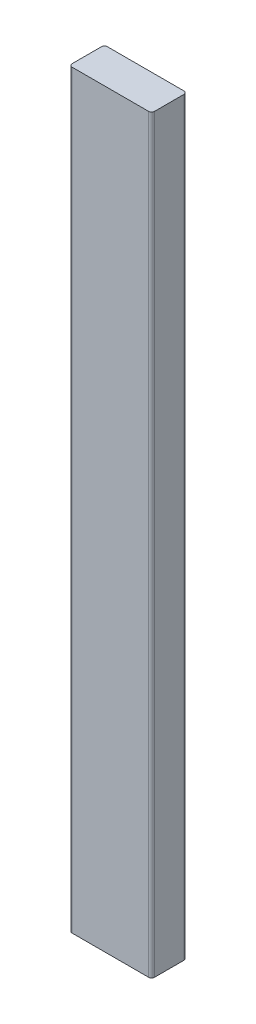
ISO-10303-21;
HEADER;
FILE_DESCRIPTION(('STEP AP214'),'2;1');
FILE_NAME('part.step','',(''),(''),'','','');
FILE_SCHEMA(('AUTOMOTIVE_DESIGN { 1 0 10303 214 1 1 1 1 }'));
ENDSEC;
DATA;
#1=APPLICATION_CONTEXT('core data for automotive mechanical design processes');
#2=APPLICATION_PROTOCOL_DEFINITION('international standard','automotive_design',2000,#1);
#3=PRODUCT_CONTEXT('',#1,'mechanical');
#4=PRODUCT('Part','Part','',(#3));
#5=PRODUCT_RELATED_PRODUCT_CATEGORY('part','',(#4));
#6=PRODUCT_DEFINITION_FORMATION('','',#4);
#7=PRODUCT_DEFINITION_CONTEXT('part definition',#1,'design');
#8=PRODUCT_DEFINITION('design','',#6,#7);
#9=PRODUCT_DEFINITION_SHAPE('','',#8);
#10=(LENGTH_UNIT() NAMED_UNIT(*) SI_UNIT(.MILLI.,.METRE.));
#11=(NAMED_UNIT(*) PLANE_ANGLE_UNIT() SI_UNIT($,.RADIAN.));
#12=(NAMED_UNIT(*) SI_UNIT($,.STERADIAN.) SOLID_ANGLE_UNIT());
#13=UNCERTAINTY_MEASURE_WITH_UNIT(LENGTH_MEASURE(1.E-05),#10,'distance_accuracy_value','');
#14=(GEOMETRIC_REPRESENTATION_CONTEXT(3) GLOBAL_UNCERTAINTY_ASSIGNED_CONTEXT((#13)) GLOBAL_UNIT_ASSIGNED_CONTEXT((#10,
#11,#12)) REPRESENTATION_CONTEXT('',''));
#15=CARTESIAN_POINT('',(0.,0.,0.));
#16=DIRECTION('',(0.,0.,1.));
#17=DIRECTION('',(1.,0.,0.));
#18=AXIS2_PLACEMENT_3D('',#15,#16,#17);
#19=CARTESIAN_POINT('',(-44.4500000000001,808.0375,-19.0499999999989));
#20=DIRECTION('',(1.,0.,0.));
#21=DIRECTION('',(0.,0.,-1.));
#22=AXIS2_PLACEMENT_3D('',#19,#20,#21);
#23=PLANE('',#22);
#24=DIRECTION('',(0.,0.,1.));
#25=VECTOR('',#24,1.);
#26=CARTESIAN_POINT('',(-44.4500000000001,808.0375,-19.0499999999989));
#27=LINE('',#26,#25);
#28=CARTESIAN_POINT('',(-44.4500000000001,808.0375,-15.874999999999));
#29=VERTEX_POINT('',#28);
#30=CARTESIAN_POINT('',(-44.45,808.0375,15.875000000001));
#31=VERTEX_POINT('',#30);
#32=EDGE_CURVE('E118',#29,#31,#27,.T.);
#33=ORIENTED_EDGE('',*,*,#32,.F.);
#34=DIRECTION('',(0.,-1.,0.));
#35=VECTOR('',#34,1.);
#36=CARTESIAN_POINT('',(-44.4500000000001,808.0375,-15.874999999999));
#37=LINE('',#36,#35);
#38=CARTESIAN_POINT('',(-44.4500000000001,0.,-15.8750000000001));
#39=VERTEX_POINT('',#38);
#40=EDGE_CURVE('E103',#29,#39,#37,.T.);
#41=ORIENTED_EDGE('',*,*,#40,.T.);
#42=DIRECTION('',(0.,0.,1.));
#43=VECTOR('',#42,1.);
#44=CARTESIAN_POINT('',(-44.4500000000001,0.,-19.05));
#45=LINE('',#44,#43);
#46=CARTESIAN_POINT('',(-44.45,0.,15.8750000000001));
#47=VERTEX_POINT('',#46);
#48=EDGE_CURVE('E115',#39,#47,#45,.T.);
#49=ORIENTED_EDGE('',*,*,#48,.T.);
#50=DIRECTION('',(0.,-1.,0.));
#51=VECTOR('',#50,1.);
#52=CARTESIAN_POINT('',(-44.45,808.0375,15.875000000001));
#53=LINE('',#52,#51);
#54=EDGE_CURVE('E120',#47,#31,#53,.F.);
#55=ORIENTED_EDGE('',*,*,#54,.T.);
#56=EDGE_LOOP('',(#33,#41,#49,#55));
#57=FACE_BOUND('',#56,.T.);
#58=ADVANCED_FACE('F34',(#57),#23,.F.);
#59=CARTESIAN_POINT('',(44.4499999999997,808.0375,19.0500000000011));
#60=DIRECTION('',(0.,0.,-1.));
#61=DIRECTION('',(-1.,0.,0.));
#62=AXIS2_PLACEMENT_3D('',#59,#60,#61);
#63=PLANE('',#62);
#64=DIRECTION('',(1.,0.,0.));
#65=VECTOR('',#64,1.);
#66=CARTESIAN_POINT('',(44.4499999999997,808.0375,19.0500000000011));
#67=LINE('',#66,#65);
#68=CARTESIAN_POINT('',(-41.275,808.0375,19.0500000000011));
#69=VERTEX_POINT('',#68);
#70=CARTESIAN_POINT('',(41.2749999999997,808.0375,19.0500000000011));
#71=VERTEX_POINT('',#70);
#72=EDGE_CURVE('E169',#69,#71,#67,.T.);
#73=ORIENTED_EDGE('',*,*,#72,.F.);
#74=DIRECTION('',(0.,-1.,0.));
#75=VECTOR('',#74,1.);
#76=CARTESIAN_POINT('',(-41.275,808.0375,19.0500000000011));
#77=LINE('',#76,#75);
#78=CARTESIAN_POINT('',(-41.275,0.,19.05));
#79=VERTEX_POINT('',#78);
#80=EDGE_CURVE('E153',#69,#79,#77,.T.);
#81=ORIENTED_EDGE('',*,*,#80,.T.);
#82=DIRECTION('',(1.,0.,0.));
#83=VECTOR('',#82,1.);
#84=CARTESIAN_POINT('',(44.4499999999997,0.,19.05));
#85=LINE('',#84,#83);
#86=CARTESIAN_POINT('',(41.2749999999997,0.,19.05));
#87=VERTEX_POINT('',#86);
#88=EDGE_CURVE('E124',#79,#87,#85,.T.);
#89=ORIENTED_EDGE('',*,*,#88,.T.);
#90=DIRECTION('',(0.,-1.,0.));
#91=VECTOR('',#90,1.);
#92=CARTESIAN_POINT('',(41.2749999999997,808.0375,19.0500000000011));
#93=LINE('',#92,#91);
#94=EDGE_CURVE('E151',#87,#71,#93,.F.);
#95=ORIENTED_EDGE('',*,*,#94,.T.);
#96=EDGE_LOOP('',(#73,#81,#89,#95));
#97=FACE_BOUND('',#96,.T.);
#98=ADVANCED_FACE('F179',(#97),#63,.F.);
#99=CARTESIAN_POINT('',(44.4499999999997,808.0375,-19.0499999999989));
#100=DIRECTION('',(-1.,0.,0.));
#101=DIRECTION('',(0.,0.,1.));
#102=AXIS2_PLACEMENT_3D('',#99,#100,#101);
#103=PLANE('',#102);
#104=DIRECTION('',(0.,0.,-1.));
#105=VECTOR('',#104,1.);
#106=CARTESIAN_POINT('',(44.4499999999998,0.,-19.05));
#107=LINE('',#106,#105);
#108=CARTESIAN_POINT('',(44.4499999999997,0.,15.8750000000001));
#109=VERTEX_POINT('',#108);
#110=CARTESIAN_POINT('',(44.4499999999997,0.,-15.8750000000001));
#111=VERTEX_POINT('',#110);
#112=EDGE_CURVE('E127',#109,#111,#107,.T.);
#113=ORIENTED_EDGE('',*,*,#112,.T.);
#114=DIRECTION('',(0.,-1.,0.));
#115=VECTOR('',#114,1.);
#116=CARTESIAN_POINT('',(44.4499999999997,808.0375,-15.874999999999));
#117=LINE('',#116,#115);
#118=CARTESIAN_POINT('',(44.4499999999997,808.0375,-15.874999999999));
#119=VERTEX_POINT('',#118);
#120=EDGE_CURVE('E11',#111,#119,#117,.F.);
#121=ORIENTED_EDGE('',*,*,#120,.T.);
#122=DIRECTION('',(0.,0.,-1.));
#123=VECTOR('',#122,1.);
#124=CARTESIAN_POINT('',(44.4499999999997,808.0375,-19.0499999999989));
#125=LINE('',#124,#123);
#126=CARTESIAN_POINT('',(44.4499999999997,808.0375,15.875000000001));
#127=VERTEX_POINT('',#126);
#128=EDGE_CURVE('E159',#127,#119,#125,.T.);
#129=ORIENTED_EDGE('',*,*,#128,.F.);
#130=DIRECTION('',(0.,-1.,0.));
#131=VECTOR('',#130,1.);
#132=CARTESIAN_POINT('',(44.4499999999997,808.0375,15.875000000001));
#133=LINE('',#132,#131);
#134=EDGE_CURVE('E42',#127,#109,#133,.T.);
#135=ORIENTED_EDGE('',*,*,#134,.T.);
#136=EDGE_LOOP('',(#113,#121,#129,#135));
#137=FACE_BOUND('',#136,.T.);
#138=ADVANCED_FACE('F158',(#137),#103,.F.);
#139=CARTESIAN_POINT('',(44.4499999999997,808.0375,-19.0499999999989));
#140=DIRECTION('',(0.,0.,1.));
#141=DIRECTION('',(1.,0.,0.));
#142=AXIS2_PLACEMENT_3D('',#139,#140,#141);
#143=PLANE('',#142);
#144=DIRECTION('',(-1.,0.,0.));
#145=VECTOR('',#144,1.);
#146=CARTESIAN_POINT('',(44.4499999999998,0.,-19.05));
#147=LINE('',#146,#145);
#148=CARTESIAN_POINT('',(41.2749999999998,0.,-19.05));
#149=VERTEX_POINT('',#148);
#150=CARTESIAN_POINT('',(-41.2750000000001,0.,-19.05));
#151=VERTEX_POINT('',#150);
#152=EDGE_CURVE('E134',#149,#151,#147,.T.);
#153=ORIENTED_EDGE('',*,*,#152,.T.);
#154=DIRECTION('',(0.,-1.,0.));
#155=VECTOR('',#154,1.);
#156=CARTESIAN_POINT('',(-41.2750000000001,808.0375,-19.0499999999989));
#157=LINE('',#156,#155);
#158=CARTESIAN_POINT('',(-41.2750000000001,808.0375,-19.0499999999989));
#159=VERTEX_POINT('',#158);
#160=EDGE_CURVE('E104',#151,#159,#157,.F.);
#161=ORIENTED_EDGE('',*,*,#160,.T.);
#162=DIRECTION('',(-1.,0.,0.));
#163=VECTOR('',#162,1.);
#164=CARTESIAN_POINT('',(44.4499999999997,808.0375,-19.0499999999989));
#165=LINE('',#164,#163);
#166=CARTESIAN_POINT('',(41.2749999999997,808.0375,-19.0499999999989));
#167=VERTEX_POINT('',#166);
#168=EDGE_CURVE('E130',#167,#159,#165,.T.);
#169=ORIENTED_EDGE('',*,*,#168,.F.);
#170=DIRECTION('',(0.,-1.,0.));
#171=VECTOR('',#170,1.);
#172=CARTESIAN_POINT('',(41.2749999999997,808.0375,-19.0499999999989));
#173=LINE('',#172,#171);
#174=EDGE_CURVE('E109',#167,#149,#173,.T.);
#175=ORIENTED_EDGE('',*,*,#174,.T.);
#176=EDGE_LOOP('',(#153,#161,#169,#175));
#177=FACE_BOUND('',#176,.T.);
#178=ADVANCED_FACE('F167',(#177),#143,.F.);
#179=CARTESIAN_POINT('',(0.,808.0375,1.12410081243297E-12));
#180=DIRECTION('',(0.,-1.,0.));
#181=DIRECTION('',(0.,0.,-1.));
#182=AXIS2_PLACEMENT_3D('',#179,#180,#181);
#183=PLANE('',#182);
#184=ORIENTED_EDGE('',*,*,#168,.T.);
#185=CARTESIAN_POINT('',(-41.2750000000001,808.0375,-15.874999999999));
#186=DIRECTION('',(0.,-1.,0.));
#187=DIRECTION('',(0.,0.,-1.));
#188=AXIS2_PLACEMENT_3D('',#185,#186,#187);
#189=CIRCLE('',#188,3.175);
#190=EDGE_CURVE('E149',#159,#29,#189,.F.);
#191=ORIENTED_EDGE('',*,*,#190,.T.);
#192=ORIENTED_EDGE('',*,*,#32,.T.);
#193=CARTESIAN_POINT('',(-41.275,808.0375,15.875000000001));
#194=DIRECTION('',(0.,-1.,0.));
#195=DIRECTION('',(0.,0.,-1.));
#196=AXIS2_PLACEMENT_3D('',#193,#194,#195);
#197=CIRCLE('',#196,3.175);
#198=EDGE_CURVE('E147',#31,#69,#197,.F.);
#199=ORIENTED_EDGE('',*,*,#198,.T.);
#200=ORIENTED_EDGE('',*,*,#72,.T.);
#201=CARTESIAN_POINT('',(41.2749999999997,808.0375,15.875000000001));
#202=DIRECTION('',(0.,-1.,0.));
#203=DIRECTION('',(0.,0.,-1.));
#204=AXIS2_PLACEMENT_3D('',#201,#202,#203);
#205=CIRCLE('',#204,3.175);
#206=EDGE_CURVE('E54',#71,#127,#205,.F.);
#207=ORIENTED_EDGE('',*,*,#206,.T.);
#208=ORIENTED_EDGE('',*,*,#128,.T.);
#209=CARTESIAN_POINT('',(41.2749999999997,808.0375,-15.874999999999));
#210=DIRECTION('',(0.,-1.,0.));
#211=DIRECTION('',(0.,0.,-1.));
#212=AXIS2_PLACEMENT_3D('',#209,#210,#211);
#213=CIRCLE('',#212,3.175);
#214=EDGE_CURVE('E145',#119,#167,#213,.F.);
#215=ORIENTED_EDGE('',*,*,#214,.T.);
#216=EDGE_LOOP('',(#184,#191,#192,#199,#200,#207,#208,#215));
#217=FACE_BOUND('',#216,.T.);
#218=ADVANCED_FACE('F173',(#217),#183,.F.);
#219=CARTESIAN_POINT('',(0.,0.,0.));
#220=DIRECTION('',(0.,-1.,0.));
#221=DIRECTION('',(0.,0.,-1.));
#222=AXIS2_PLACEMENT_3D('',#219,#220,#221);
#223=PLANE('',#222);
#224=ORIENTED_EDGE('',*,*,#48,.F.);
#225=CARTESIAN_POINT('',(-41.2750000000001,0.,-15.8750000000001));
#226=DIRECTION('',(0.,-1.,0.));
#227=DIRECTION('',(0.,0.,-1.));
#228=AXIS2_PLACEMENT_3D('',#225,#226,#227);
#229=CIRCLE('',#228,3.175);
#230=EDGE_CURVE('E99',#39,#151,#229,.T.);
#231=ORIENTED_EDGE('',*,*,#230,.T.);
#232=ORIENTED_EDGE('',*,*,#152,.F.);
#233=CARTESIAN_POINT('',(41.2749999999997,0.,-15.8750000000001));
#234=DIRECTION('',(0.,-1.,0.));
#235=DIRECTION('',(0.,0.,-1.));
#236=AXIS2_PLACEMENT_3D('',#233,#234,#235);
#237=CIRCLE('',#236,3.175);
#238=EDGE_CURVE('E138',#149,#111,#237,.T.);
#239=ORIENTED_EDGE('',*,*,#238,.T.);
#240=ORIENTED_EDGE('',*,*,#112,.F.);
#241=CARTESIAN_POINT('',(41.2749999999997,0.,15.8750000000001));
#242=DIRECTION('',(0.,-1.,0.));
#243=DIRECTION('',(0.,0.,-1.));
#244=AXIS2_PLACEMENT_3D('',#241,#242,#243);
#245=CIRCLE('',#244,3.175);
#246=EDGE_CURVE('E119',#109,#87,#245,.T.);
#247=ORIENTED_EDGE('',*,*,#246,.T.);
#248=ORIENTED_EDGE('',*,*,#88,.F.);
#249=CARTESIAN_POINT('',(-41.275,0.,15.8750000000001));
#250=DIRECTION('',(0.,-1.,0.));
#251=DIRECTION('',(0.,0.,-1.));
#252=AXIS2_PLACEMENT_3D('',#249,#250,#251);
#253=CIRCLE('',#252,3.175);
#254=EDGE_CURVE('E110',#79,#47,#253,.T.);
#255=ORIENTED_EDGE('',*,*,#254,.T.);
#256=EDGE_LOOP('',(#224,#231,#232,#239,#240,#247,#248,#255));
#257=FACE_BOUND('',#256,.T.);
#258=ADVANCED_FACE('F122',(#257),#223,.T.);
#259=CARTESIAN_POINT('',(-41.2750000000001,808.0375,-15.874999999999));
#260=DIRECTION('',(0.,-1.,0.));
#261=DIRECTION('',(0.,0.,-1.));
#262=AXIS2_PLACEMENT_3D('',#259,#260,#261);
#263=CYLINDRICAL_SURFACE('',#262,3.175);
#264=ORIENTED_EDGE('',*,*,#190,.F.);
#265=ORIENTED_EDGE('',*,*,#160,.F.);
#266=ORIENTED_EDGE('',*,*,#230,.F.);
#267=ORIENTED_EDGE('',*,*,#40,.F.);
#268=EDGE_LOOP('',(#264,#265,#266,#267));
#269=FACE_BOUND('',#268,.T.);
#270=ADVANCED_FACE('F102',(#269),#263,.T.);
#271=CARTESIAN_POINT('',(-41.275,808.0375,15.875000000001));
#272=DIRECTION('',(0.,-1.,0.));
#273=DIRECTION('',(0.,0.,-1.));
#274=AXIS2_PLACEMENT_3D('',#271,#272,#273);
#275=CYLINDRICAL_SURFACE('',#274,3.175);
#276=ORIENTED_EDGE('',*,*,#198,.F.);
#277=ORIENTED_EDGE('',*,*,#54,.F.);
#278=ORIENTED_EDGE('',*,*,#254,.F.);
#279=ORIENTED_EDGE('',*,*,#80,.F.);
#280=EDGE_LOOP('',(#276,#277,#278,#279));
#281=FACE_BOUND('',#280,.T.);
#282=ADVANCED_FACE('F177',(#281),#275,.T.);
#283=CARTESIAN_POINT('',(41.2749999999997,808.0375,-15.874999999999));
#284=DIRECTION('',(0.,-1.,0.));
#285=DIRECTION('',(0.,0.,-1.));
#286=AXIS2_PLACEMENT_3D('',#283,#284,#285);
#287=CYLINDRICAL_SURFACE('',#286,3.175);
#288=ORIENTED_EDGE('',*,*,#214,.F.);
#289=ORIENTED_EDGE('',*,*,#120,.F.);
#290=ORIENTED_EDGE('',*,*,#238,.F.);
#291=ORIENTED_EDGE('',*,*,#174,.F.);
#292=EDGE_LOOP('',(#288,#289,#290,#291));
#293=FACE_BOUND('',#292,.T.);
#294=ADVANCED_FACE('F164',(#293),#287,.T.);
#295=CARTESIAN_POINT('',(41.2749999999997,808.0375,15.875000000001));
#296=DIRECTION('',(0.,-1.,0.));
#297=DIRECTION('',(0.,0.,-1.));
#298=AXIS2_PLACEMENT_3D('',#295,#296,#297);
#299=CYLINDRICAL_SURFACE('',#298,3.175);
#300=ORIENTED_EDGE('',*,*,#206,.F.);
#301=ORIENTED_EDGE('',*,*,#94,.F.);
#302=ORIENTED_EDGE('',*,*,#246,.F.);
#303=ORIENTED_EDGE('',*,*,#134,.F.);
#304=EDGE_LOOP('',(#300,#301,#302,#303));
#305=FACE_BOUND('',#304,.T.);
#306=ADVANCED_FACE('F36',(#305),#299,.T.);
#307=CLOSED_SHELL('',(#58,#98,#138,#178,#218,#258,#270,#282,#294,#306));
#308=MANIFOLD_SOLID_BREP('B2',#307);
#309=ADVANCED_BREP_SHAPE_REPRESENTATION('',(#18,#308),#14);
#310=SHAPE_DEFINITION_REPRESENTATION(#9,#309);
ENDSEC;
END-ISO-10303-21;
